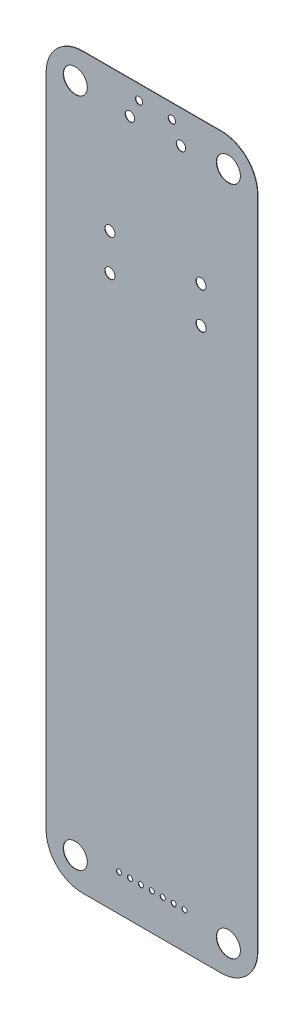
ISO-10303-21;
HEADER;
FILE_DESCRIPTION(('STEP AP214'),'2;1');
FILE_NAME('part.step','',(''),(''),'','','');
FILE_SCHEMA(('AUTOMOTIVE_DESIGN { 1 0 10303 214 1 1 1 1 }'));
ENDSEC;
DATA;
#1=APPLICATION_CONTEXT('core data for automotive mechanical design processes');
#2=APPLICATION_PROTOCOL_DEFINITION('international standard','automotive_design',2000,#1);
#3=PRODUCT_CONTEXT('',#1,'mechanical');
#4=PRODUCT('Part','Part','',(#3));
#5=PRODUCT_RELATED_PRODUCT_CATEGORY('part','',(#4));
#6=PRODUCT_DEFINITION_FORMATION('','',#4);
#7=PRODUCT_DEFINITION_CONTEXT('part definition',#1,'design');
#8=PRODUCT_DEFINITION('design','',#6,#7);
#9=PRODUCT_DEFINITION_SHAPE('','',#8);
#10=(LENGTH_UNIT() NAMED_UNIT(*) SI_UNIT(.MILLI.,.METRE.));
#11=(NAMED_UNIT(*) PLANE_ANGLE_UNIT() SI_UNIT($,.RADIAN.));
#12=(NAMED_UNIT(*) SI_UNIT($,.STERADIAN.) SOLID_ANGLE_UNIT());
#13=UNCERTAINTY_MEASURE_WITH_UNIT(LENGTH_MEASURE(1.E-05),#10,'distance_accuracy_value','');
#14=(GEOMETRIC_REPRESENTATION_CONTEXT(3) GLOBAL_UNCERTAINTY_ASSIGNED_CONTEXT((#13)) GLOBAL_UNIT_ASSIGNED_CONTEXT((#10,
#11,#12)) REPRESENTATION_CONTEXT('',''));
#15=CARTESIAN_POINT('',(0.,0.,0.));
#16=DIRECTION('',(0.,0.,1.));
#17=DIRECTION('',(1.,0.,0.));
#18=AXIS2_PLACEMENT_3D('',#15,#16,#17);
#19=CARTESIAN_POINT('',(14.5,50.,-0.0525));
#20=DIRECTION('',(0.,0.,1.));
#21=DIRECTION('',(1.,0.,0.));
#22=AXIS2_PLACEMENT_3D('',#19,#20,#21);
#23=PLANE('',#22);
#24=CARTESIAN_POINT('',(12.75,98.,-0.052500000000002));
#25=DIRECTION('',(0.,0.,1.));
#26=DIRECTION('',(1.,0.,0.));
#27=AXIS2_PLACEMENT_3D('',#24,#25,#26);
#28=CIRCLE('',#27,0.5);
#29=CARTESIAN_POINT('',(12.25,98.,-0.052500000000002));
#30=VERTEX_POINT('',#29);
#31=EDGE_CURVE('E261',#30,#30,#28,.T.);
#32=ORIENTED_EDGE('',*,*,#31,.T.);
#33=EDGE_LOOP('',(#32));
#34=FACE_BOUND('',#33,.T.);
#35=CARTESIAN_POINT('',(19.,5.,-0.052500000000002));
#36=DIRECTION('',(0.,0.,1.));
#37=DIRECTION('',(1.,0.,0.));
#38=AXIS2_PLACEMENT_3D('',#35,#36,#37);
#39=CIRCLE('',#38,0.35);
#40=CARTESIAN_POINT('',(18.65,5.,-0.052500000000002));
#41=VERTEX_POINT('',#40);
#42=EDGE_CURVE('E324',#41,#41,#39,.T.);
#43=ORIENTED_EDGE('',*,*,#42,.T.);
#44=EDGE_LOOP('',(#43));
#45=FACE_BOUND('',#44,.T.);
#46=CARTESIAN_POINT('',(21.25,75.5,-0.052500000000002));
#47=DIRECTION('',(0.,0.,1.));
#48=DIRECTION('',(1.,0.,0.));
#49=AXIS2_PLACEMENT_3D('',#46,#47,#48);
#50=CIRCLE('',#49,0.7);
#51=CARTESIAN_POINT('',(20.55,75.5,-0.052500000000002));
#52=VERTEX_POINT('',#51);
#53=EDGE_CURVE('E306',#52,#52,#50,.T.);
#54=ORIENTED_EDGE('',*,*,#53,.T.);
#55=EDGE_LOOP('',(#54));
#56=FACE_BOUND('',#55,.T.);
#57=CARTESIAN_POINT('',(16.,5.,-0.052500000000002));
#58=DIRECTION('',(0.,0.,1.));
#59=DIRECTION('',(1.,0.,0.));
#60=AXIS2_PLACEMENT_3D('',#57,#58,#59);
#61=CIRCLE('',#60,0.35);
#62=CARTESIAN_POINT('',(15.65,5.,-0.052500000000002));
#63=VERTEX_POINT('',#62);
#64=EDGE_CURVE('E347',#63,#63,#61,.T.);
#65=ORIENTED_EDGE('',*,*,#64,.T.);
#66=EDGE_LOOP('',(#65));
#67=FACE_BOUND('',#66,.T.);
#68=CARTESIAN_POINT('',(17.25,98.,-0.052500000000002));
#69=DIRECTION('',(0.,0.,1.));
#70=DIRECTION('',(1.,0.,0.));
#71=AXIS2_PLACEMENT_3D('',#68,#69,#70);
#72=CIRCLE('',#71,0.5);
#73=CARTESIAN_POINT('',(16.75,98.,-0.052500000000002));
#74=VERTEX_POINT('',#73);
#75=EDGE_CURVE('E275',#74,#74,#72,.T.);
#76=ORIENTED_EDGE('',*,*,#75,.T.);
#77=EDGE_LOOP('',(#76));
#78=FACE_BOUND('',#77,.T.);
#79=CARTESIAN_POINT('',(17.5,5.,-0.052500000000002));
#80=DIRECTION('',(0.,0.,1.));
#81=DIRECTION('',(1.,0.,0.));
#82=AXIS2_PLACEMENT_3D('',#79,#80,#81);
#83=CIRCLE('',#82,0.35);
#84=CARTESIAN_POINT('',(17.15,5.,-0.052500000000002));
#85=VERTEX_POINT('',#84);
#86=EDGE_CURVE('E333',#85,#85,#83,.T.);
#87=ORIENTED_EDGE('',*,*,#86,.T.);
#88=EDGE_LOOP('',(#87));
#89=FACE_BOUND('',#88,.T.);
#90=CARTESIAN_POINT('',(21.25,80.5,-0.052500000000002));
#91=DIRECTION('',(0.,0.,1.));
#92=DIRECTION('',(1.,0.,0.));
#93=AXIS2_PLACEMENT_3D('',#90,#91,#92);
#94=CIRCLE('',#93,0.7);
#95=CARTESIAN_POINT('',(20.55,80.5,-0.052500000000002));
#96=VERTEX_POINT('',#95);
#97=EDGE_CURVE('E238',#96,#96,#94,.T.);
#98=ORIENTED_EDGE('',*,*,#97,.T.);
#99=EDGE_LOOP('',(#98));
#100=FACE_BOUND('',#99,.T.);
#101=CARTESIAN_POINT('',(11.5,5.,-0.052500000000002));
#102=DIRECTION('',(0.,0.,1.));
#103=DIRECTION('',(1.,0.,0.));
#104=AXIS2_PLACEMENT_3D('',#101,#102,#103);
#105=CIRCLE('',#104,0.35);
#106=CARTESIAN_POINT('',(11.15,5.,-0.052500000000002));
#107=VERTEX_POINT('',#106);
#108=EDGE_CURVE('E343',#107,#107,#105,.T.);
#109=ORIENTED_EDGE('',*,*,#108,.T.);
#110=EDGE_LOOP('',(#109));
#111=FACE_BOUND('',#110,.T.);
#112=CARTESIAN_POINT('',(18.5,95.5,-0.052500000000002));
#113=DIRECTION('',(0.,0.,1.));
#114=DIRECTION('',(1.,0.,0.));
#115=AXIS2_PLACEMENT_3D('',#112,#113,#114);
#116=CIRCLE('',#115,0.65);
#117=CARTESIAN_POINT('',(17.85,95.5,-0.052500000000002));
#118=VERTEX_POINT('',#117);
#119=EDGE_CURVE('E325',#118,#118,#116,.T.);
#120=ORIENTED_EDGE('',*,*,#119,.T.);
#121=EDGE_LOOP('',(#120));
#122=FACE_BOUND('',#121,.T.);
#123=CARTESIAN_POINT('',(10.,5.,-0.052500000000002));
#124=DIRECTION('',(0.,0.,1.));
#125=DIRECTION('',(1.,0.,0.));
#126=AXIS2_PLACEMENT_3D('',#123,#124,#125);
#127=CIRCLE('',#126,0.35);
#128=CARTESIAN_POINT('',(9.65,5.,-0.052500000000002));
#129=VERTEX_POINT('',#128);
#130=EDGE_CURVE('E451',#129,#129,#127,.T.);
#131=ORIENTED_EDGE('',*,*,#130,.T.);
#132=EDGE_LOOP('',(#131));
#133=FACE_BOUND('',#132,.T.);
#134=CARTESIAN_POINT('',(8.75,75.5,-0.052500000000002));
#135=DIRECTION('',(0.,0.,1.));
#136=DIRECTION('',(1.,0.,0.));
#137=AXIS2_PLACEMENT_3D('',#134,#135,#136);
#138=CIRCLE('',#137,0.7);
#139=CARTESIAN_POINT('',(8.05,75.5,-0.052500000000002));
#140=VERTEX_POINT('',#139);
#141=EDGE_CURVE('E370',#140,#140,#138,.T.);
#142=ORIENTED_EDGE('',*,*,#141,.T.);
#143=EDGE_LOOP('',(#142));
#144=FACE_BOUND('',#143,.T.);
#145=CARTESIAN_POINT('',(13.,5.,-0.052500000000002));
#146=DIRECTION('',(0.,0.,1.));
#147=DIRECTION('',(1.,0.,0.));
#148=AXIS2_PLACEMENT_3D('',#145,#146,#147);
#149=CIRCLE('',#148,0.35);
#150=CARTESIAN_POINT('',(12.65,5.,-0.052500000000002));
#151=VERTEX_POINT('',#150);
#152=EDGE_CURVE('E296',#151,#151,#149,.T.);
#153=ORIENTED_EDGE('',*,*,#152,.T.);
#154=EDGE_LOOP('',(#153));
#155=FACE_BOUND('',#154,.T.);
#156=CARTESIAN_POINT('',(11.5,95.5,-0.052500000000002));
#157=DIRECTION('',(0.,0.,1.));
#158=DIRECTION('',(1.,0.,0.));
#159=AXIS2_PLACEMENT_3D('',#156,#157,#158);
#160=CIRCLE('',#159,0.65);
#161=CARTESIAN_POINT('',(10.85,95.5,-0.052500000000002));
#162=VERTEX_POINT('',#161);
#163=EDGE_CURVE('E408',#162,#162,#160,.T.);
#164=ORIENTED_EDGE('',*,*,#163,.T.);
#165=EDGE_LOOP('',(#164));
#166=FACE_BOUND('',#165,.T.);
#167=CARTESIAN_POINT('',(14.5,5.,-0.052500000000002));
#168=DIRECTION('',(0.,0.,1.));
#169=DIRECTION('',(1.,0.,0.));
#170=AXIS2_PLACEMENT_3D('',#167,#168,#169);
#171=CIRCLE('',#170,0.35);
#172=CARTESIAN_POINT('',(14.15,5.,-0.052500000000002));
#173=VERTEX_POINT('',#172);
#174=EDGE_CURVE('E290',#173,#173,#171,.T.);
#175=ORIENTED_EDGE('',*,*,#174,.T.);
#176=EDGE_LOOP('',(#175));
#177=FACE_BOUND('',#176,.T.);
#178=CARTESIAN_POINT('',(8.75,80.5,-0.052500000000002));
#179=DIRECTION('',(0.,0.,1.));
#180=DIRECTION('',(1.,0.,0.));
#181=AXIS2_PLACEMENT_3D('',#178,#179,#180);
#182=CIRCLE('',#181,0.7);
#183=CARTESIAN_POINT('',(8.05,80.5,-0.052500000000002));
#184=VERTEX_POINT('',#183);
#185=EDGE_CURVE('E473',#184,#184,#182,.T.);
#186=ORIENTED_EDGE('',*,*,#185,.T.);
#187=EDGE_LOOP('',(#186));
#188=FACE_BOUND('',#187,.T.);
#189=CARTESIAN_POINT('',(4.,96.,-0.0525));
#190=DIRECTION('',(0.,0.,1.));
#191=DIRECTION('',(1.,0.,0.));
#192=AXIS2_PLACEMENT_3D('',#189,#190,#191);
#193=CIRCLE('',#192,1.651);
#194=CARTESIAN_POINT('',(2.349,96.,-0.0525));
#195=VERTEX_POINT('',#194);
#196=EDGE_CURVE('E255',#195,#195,#193,.T.);
#197=ORIENTED_EDGE('',*,*,#196,.T.);
#198=EDGE_LOOP('',(#197));
#199=FACE_BOUND('',#198,.T.);
#200=CARTESIAN_POINT('',(4.,4.,-0.0525));
#201=DIRECTION('',(0.,0.,1.));
#202=DIRECTION('',(1.,0.,0.));
#203=AXIS2_PLACEMENT_3D('',#200,#201,#202);
#204=CIRCLE('',#203,1.651);
#205=CARTESIAN_POINT('',(2.349,4.,-0.0525));
#206=VERTEX_POINT('',#205);
#207=EDGE_CURVE('E286',#206,#206,#204,.T.);
#208=ORIENTED_EDGE('',*,*,#207,.T.);
#209=EDGE_LOOP('',(#208));
#210=FACE_BOUND('',#209,.T.);
#211=CARTESIAN_POINT('',(25.,96.,-0.0525));
#212=DIRECTION('',(0.,0.,1.));
#213=DIRECTION('',(1.,0.,0.));
#214=AXIS2_PLACEMENT_3D('',#211,#212,#213);
#215=CIRCLE('',#214,1.651);
#216=CARTESIAN_POINT('',(23.349,96.,-0.0525));
#217=VERTEX_POINT('',#216);
#218=EDGE_CURVE('E417',#217,#217,#215,.T.);
#219=ORIENTED_EDGE('',*,*,#218,.T.);
#220=EDGE_LOOP('',(#219));
#221=FACE_BOUND('',#220,.T.);
#222=CARTESIAN_POINT('',(25.,4.,-0.0525));
#223=DIRECTION('',(0.,0.,1.));
#224=DIRECTION('',(1.,0.,0.));
#225=AXIS2_PLACEMENT_3D('',#222,#223,#224);
#226=CIRCLE('',#225,1.651);
#227=CARTESIAN_POINT('',(23.349,4.,-0.0525));
#228=VERTEX_POINT('',#227);
#229=EDGE_CURVE('E338',#228,#228,#226,.T.);
#230=ORIENTED_EDGE('',*,*,#229,.T.);
#231=EDGE_LOOP('',(#230));
#232=FACE_BOUND('',#231,.T.);
#233=DIRECTION('',(0.,1.,0.));
#234=VECTOR('',#233,1.);
#235=CARTESIAN_POINT('',(0.,94.999999767949,-0.0525));
#236=LINE('',#235,#234);
#237=CARTESIAN_POINT('',(0.,4.99999976794896,-0.0525));
#238=VERTEX_POINT('',#237);
#239=CARTESIAN_POINT('',(0.,94.999999767949,-0.0525));
#240=VERTEX_POINT('',#239);
#241=EDGE_CURVE('E11',#238,#240,#236,.T.);
#242=ORIENTED_EDGE('',*,*,#241,.T.);
#243=CARTESIAN_POINT('',(5.,95.,-0.0525));
#244=DIRECTION('',(0.,0.,-1.));
#245=DIRECTION('',(2.67948965237963E-08,1.,0.));
#246=AXIS2_PLACEMENT_3D('',#243,#244,#245);
#247=CIRCLE('',#246,5.);
#248=CARTESIAN_POINT('',(5.00000013397448,100.,-0.0525));
#249=VERTEX_POINT('',#248);
#250=EDGE_CURVE('E318',#240,#249,#247,.T.);
#251=ORIENTED_EDGE('',*,*,#250,.T.);
#252=DIRECTION('',(1.,0.,0.));
#253=VECTOR('',#252,1.);
#254=CARTESIAN_POINT('',(24.0000001339745,100.,-0.0525));
#255=LINE('',#254,#253);
#256=CARTESIAN_POINT('',(24.0000001339745,100.,-0.0525));
#257=VERTEX_POINT('',#256);
#258=EDGE_CURVE('E311',#249,#257,#255,.T.);
#259=ORIENTED_EDGE('',*,*,#258,.T.);
#260=CARTESIAN_POINT('',(24.,95.,-0.0525));
#261=DIRECTION('',(0.,0.,-1.));
#262=DIRECTION('',(1.,0.,0.));
#263=AXIS2_PLACEMENT_3D('',#260,#261,#262);
#264=CIRCLE('',#263,5.);
#265=CARTESIAN_POINT('',(29.,95.,-0.0525));
#266=VERTEX_POINT('',#265);
#267=EDGE_CURVE('E271',#257,#266,#264,.T.);
#268=ORIENTED_EDGE('',*,*,#267,.T.);
#269=DIRECTION('',(0.,-1.,0.));
#270=VECTOR('',#269,1.);
#271=CARTESIAN_POINT('',(29.,4.99999996410207,-0.0525));
#272=LINE('',#271,#270);
#273=CARTESIAN_POINT('',(29.,4.99999996410207,-0.0525));
#274=VERTEX_POINT('',#273);
#275=EDGE_CURVE('E267',#266,#274,#272,.T.);
#276=ORIENTED_EDGE('',*,*,#275,.T.);
#277=CARTESIAN_POINT('',(24.,5.,-0.0525));
#278=DIRECTION('',(0.,0.,-1.));
#279=DIRECTION('',(1.96153102649532E-08,-1.,0.));
#280=AXIS2_PLACEMENT_3D('',#277,#278,#279);
#281=CIRCLE('',#280,5.);
#282=CARTESIAN_POINT('',(24.0000000980766,0.,-0.0525));
#283=VERTEX_POINT('',#282);
#284=EDGE_CURVE('E399',#274,#283,#281,.T.);
#285=ORIENTED_EDGE('',*,*,#284,.T.);
#286=DIRECTION('',(-1.,0.,0.));
#287=VECTOR('',#286,1.);
#288=CARTESIAN_POINT('',(5.00000009807655,0.,-0.0525));
#289=LINE('',#288,#287);
#290=CARTESIAN_POINT('',(5.00000009807655,0.,-0.0525));
#291=VERTEX_POINT('',#290);
#292=EDGE_CURVE('E420',#283,#291,#289,.T.);
#293=ORIENTED_EDGE('',*,*,#292,.T.);
#294=CARTESIAN_POINT('',(5.,5.,-0.0525));
#295=DIRECTION('',(0.,0.,-1.));
#296=DIRECTION('',(-1.,-4.64102066777272E-08,0.));
#297=AXIS2_PLACEMENT_3D('',#294,#295,#296);
#298=CIRCLE('',#297,5.);
#299=EDGE_CURVE('E382',#291,#238,#298,.T.);
#300=ORIENTED_EDGE('',*,*,#299,.T.);
#301=EDGE_LOOP('',(#242,#251,#259,#268,#276,#285,#293,#300));
#302=FACE_BOUND('',#301,.T.);
#303=ADVANCED_FACE('F17',(#34,#45,#56,#67,#78,#89,#100,#111,#122,#133,#144,#155,#166,#177,#188,
#199,#210,#221,#232,#302),#23,.F.);
#304=CARTESIAN_POINT('',(14.5,50.,0.));
#305=DIRECTION('',(0.,0.,1.));
#306=DIRECTION('',(1.,0.,0.));
#307=AXIS2_PLACEMENT_3D('',#304,#305,#306);
#308=PLANE('',#307);
#309=CARTESIAN_POINT('',(12.75,98.,0.));
#310=DIRECTION('',(0.,0.,-1.));
#311=DIRECTION('',(1.,0.,0.));
#312=AXIS2_PLACEMENT_3D('',#309,#310,#311);
#313=CIRCLE('',#312,0.5);
#314=CARTESIAN_POINT('',(12.25,98.,0.));
#315=VERTEX_POINT('',#314);
#316=EDGE_CURVE('E260',#315,#315,#313,.T.);
#317=ORIENTED_EDGE('',*,*,#316,.T.);
#318=EDGE_LOOP('',(#317));
#319=FACE_BOUND('',#318,.T.);
#320=CARTESIAN_POINT('',(19.,5.,0.));
#321=DIRECTION('',(0.,0.,-1.));
#322=DIRECTION('',(1.,0.,0.));
#323=AXIS2_PLACEMENT_3D('',#320,#321,#322);
#324=CIRCLE('',#323,0.35);
#325=CARTESIAN_POINT('',(18.65,5.,0.));
#326=VERTEX_POINT('',#325);
#327=EDGE_CURVE('E323',#326,#326,#324,.T.);
#328=ORIENTED_EDGE('',*,*,#327,.T.);
#329=EDGE_LOOP('',(#328));
#330=FACE_BOUND('',#329,.T.);
#331=CARTESIAN_POINT('',(21.25,75.5,0.));
#332=DIRECTION('',(0.,0.,-1.));
#333=DIRECTION('',(1.,0.,0.));
#334=AXIS2_PLACEMENT_3D('',#331,#332,#333);
#335=CIRCLE('',#334,0.7);
#336=CARTESIAN_POINT('',(20.55,75.5,0.));
#337=VERTEX_POINT('',#336);
#338=EDGE_CURVE('E21',#337,#337,#335,.T.);
#339=ORIENTED_EDGE('',*,*,#338,.T.);
#340=EDGE_LOOP('',(#339));
#341=FACE_BOUND('',#340,.T.);
#342=CARTESIAN_POINT('',(16.,5.,0.));
#343=DIRECTION('',(0.,0.,-1.));
#344=DIRECTION('',(1.,0.,0.));
#345=AXIS2_PLACEMENT_3D('',#342,#343,#344);
#346=CIRCLE('',#345,0.35);
#347=CARTESIAN_POINT('',(15.65,5.,0.));
#348=VERTEX_POINT('',#347);
#349=EDGE_CURVE('E363',#348,#348,#346,.T.);
#350=ORIENTED_EDGE('',*,*,#349,.T.);
#351=EDGE_LOOP('',(#350));
#352=FACE_BOUND('',#351,.T.);
#353=CARTESIAN_POINT('',(17.25,98.,0.));
#354=DIRECTION('',(0.,0.,-1.));
#355=DIRECTION('',(1.,0.,0.));
#356=AXIS2_PLACEMENT_3D('',#353,#354,#355);
#357=CIRCLE('',#356,0.5);
#358=CARTESIAN_POINT('',(16.75,98.,0.));
#359=VERTEX_POINT('',#358);
#360=EDGE_CURVE('E344',#359,#359,#357,.T.);
#361=ORIENTED_EDGE('',*,*,#360,.T.);
#362=EDGE_LOOP('',(#361));
#363=FACE_BOUND('',#362,.T.);
#364=CARTESIAN_POINT('',(17.5,5.,0.));
#365=DIRECTION('',(0.,0.,-1.));
#366=DIRECTION('',(1.,0.,0.));
#367=AXIS2_PLACEMENT_3D('',#364,#365,#366);
#368=CIRCLE('',#367,0.35);
#369=CARTESIAN_POINT('',(17.15,5.,0.));
#370=VERTEX_POINT('',#369);
#371=EDGE_CURVE('E272',#370,#370,#368,.T.);
#372=ORIENTED_EDGE('',*,*,#371,.T.);
#373=EDGE_LOOP('',(#372));
#374=FACE_BOUND('',#373,.T.);
#375=CARTESIAN_POINT('',(21.25,80.5,0.));
#376=DIRECTION('',(0.,0.,-1.));
#377=DIRECTION('',(1.,0.,0.));
#378=AXIS2_PLACEMENT_3D('',#375,#376,#377);
#379=CIRCLE('',#378,0.7);
#380=CARTESIAN_POINT('',(20.55,80.5,0.));
#381=VERTEX_POINT('',#380);
#382=EDGE_CURVE('E239',#381,#381,#379,.T.);
#383=ORIENTED_EDGE('',*,*,#382,.T.);
#384=EDGE_LOOP('',(#383));
#385=FACE_BOUND('',#384,.T.);
#386=CARTESIAN_POINT('',(11.5,5.,0.));
#387=DIRECTION('',(0.,0.,-1.));
#388=DIRECTION('',(1.,0.,0.));
#389=AXIS2_PLACEMENT_3D('',#386,#387,#388);
#390=CIRCLE('',#389,0.35);
#391=CARTESIAN_POINT('',(11.15,5.,0.));
#392=VERTEX_POINT('',#391);
#393=EDGE_CURVE('E245',#392,#392,#390,.T.);
#394=ORIENTED_EDGE('',*,*,#393,.T.);
#395=EDGE_LOOP('',(#394));
#396=FACE_BOUND('',#395,.T.);
#397=CARTESIAN_POINT('',(18.5,95.5,0.));
#398=DIRECTION('',(0.,0.,-1.));
#399=DIRECTION('',(1.,0.,0.));
#400=AXIS2_PLACEMENT_3D('',#397,#398,#399);
#401=CIRCLE('',#400,0.65);
#402=CARTESIAN_POINT('',(17.85,95.5,0.));
#403=VERTEX_POINT('',#402);
#404=EDGE_CURVE('E340',#403,#403,#401,.T.);
#405=ORIENTED_EDGE('',*,*,#404,.T.);
#406=EDGE_LOOP('',(#405));
#407=FACE_BOUND('',#406,.T.);
#408=CARTESIAN_POINT('',(10.,5.,0.));
#409=DIRECTION('',(0.,0.,-1.));
#410=DIRECTION('',(1.,0.,0.));
#411=AXIS2_PLACEMENT_3D('',#408,#409,#410);
#412=CIRCLE('',#411,0.35);
#413=CARTESIAN_POINT('',(9.65,5.,0.));
#414=VERTEX_POINT('',#413);
#415=EDGE_CURVE('E330',#414,#414,#412,.T.);
#416=ORIENTED_EDGE('',*,*,#415,.T.);
#417=EDGE_LOOP('',(#416));
#418=FACE_BOUND('',#417,.T.);
#419=CARTESIAN_POINT('',(8.75,75.5,0.));
#420=DIRECTION('',(0.,0.,-1.));
#421=DIRECTION('',(1.,0.,0.));
#422=AXIS2_PLACEMENT_3D('',#419,#420,#421);
#423=CIRCLE('',#422,0.7);
#424=CARTESIAN_POINT('',(8.05,75.5,0.));
#425=VERTEX_POINT('',#424);
#426=EDGE_CURVE('E455',#425,#425,#423,.T.);
#427=ORIENTED_EDGE('',*,*,#426,.T.);
#428=EDGE_LOOP('',(#427));
#429=FACE_BOUND('',#428,.T.);
#430=CARTESIAN_POINT('',(13.,5.,0.));
#431=DIRECTION('',(0.,0.,-1.));
#432=DIRECTION('',(1.,0.,0.));
#433=AXIS2_PLACEMENT_3D('',#430,#431,#432);
#434=CIRCLE('',#433,0.35);
#435=CARTESIAN_POINT('',(12.65,5.,0.));
#436=VERTEX_POINT('',#435);
#437=EDGE_CURVE('E367',#436,#436,#434,.T.);
#438=ORIENTED_EDGE('',*,*,#437,.T.);
#439=EDGE_LOOP('',(#438));
#440=FACE_BOUND('',#439,.T.);
#441=CARTESIAN_POINT('',(11.5,95.5,0.));
#442=DIRECTION('',(0.,0.,-1.));
#443=DIRECTION('',(1.,0.,0.));
#444=AXIS2_PLACEMENT_3D('',#441,#442,#443);
#445=CIRCLE('',#444,0.65);
#446=CARTESIAN_POINT('',(10.85,95.5,0.));
#447=VERTEX_POINT('',#446);
#448=EDGE_CURVE('E301',#447,#447,#445,.T.);
#449=ORIENTED_EDGE('',*,*,#448,.T.);
#450=EDGE_LOOP('',(#449));
#451=FACE_BOUND('',#450,.T.);
#452=CARTESIAN_POINT('',(14.5,5.,0.));
#453=DIRECTION('',(0.,0.,-1.));
#454=DIRECTION('',(1.,0.,0.));
#455=AXIS2_PLACEMENT_3D('',#452,#453,#454);
#456=CIRCLE('',#455,0.35);
#457=CARTESIAN_POINT('',(14.15,5.,0.));
#458=VERTEX_POINT('',#457);
#459=EDGE_CURVE('E407',#458,#458,#456,.T.);
#460=ORIENTED_EDGE('',*,*,#459,.T.);
#461=EDGE_LOOP('',(#460));
#462=FACE_BOUND('',#461,.T.);
#463=CARTESIAN_POINT('',(8.75,80.5,0.));
#464=DIRECTION('',(0.,0.,-1.));
#465=DIRECTION('',(1.,0.,0.));
#466=AXIS2_PLACEMENT_3D('',#463,#464,#465);
#467=CIRCLE('',#466,0.7);
#468=CARTESIAN_POINT('',(8.05,80.5,0.));
#469=VERTEX_POINT('',#468);
#470=EDGE_CURVE('E288',#469,#469,#467,.T.);
#471=ORIENTED_EDGE('',*,*,#470,.T.);
#472=EDGE_LOOP('',(#471));
#473=FACE_BOUND('',#472,.T.);
#474=CARTESIAN_POINT('',(4.,96.,0.));
#475=DIRECTION('',(0.,0.,-1.));
#476=DIRECTION('',(1.,0.,0.));
#477=AXIS2_PLACEMENT_3D('',#474,#475,#476);
#478=CIRCLE('',#477,1.651);
#479=CARTESIAN_POINT('',(2.349,96.,0.));
#480=VERTEX_POINT('',#479);
#481=EDGE_CURVE('E281',#480,#480,#478,.T.);
#482=ORIENTED_EDGE('',*,*,#481,.T.);
#483=EDGE_LOOP('',(#482));
#484=FACE_BOUND('',#483,.T.);
#485=CARTESIAN_POINT('',(4.,4.,0.));
#486=DIRECTION('',(0.,0.,-1.));
#487=DIRECTION('',(1.,0.,0.));
#488=AXIS2_PLACEMENT_3D('',#485,#486,#487);
#489=CIRCLE('',#488,1.651);
#490=CARTESIAN_POINT('',(2.349,4.,0.));
#491=VERTEX_POINT('',#490);
#492=EDGE_CURVE('E287',#491,#491,#489,.T.);
#493=ORIENTED_EDGE('',*,*,#492,.T.);
#494=EDGE_LOOP('',(#493));
#495=FACE_BOUND('',#494,.T.);
#496=CARTESIAN_POINT('',(25.,96.,0.));
#497=DIRECTION('',(0.,0.,-1.));
#498=DIRECTION('',(1.,0.,0.));
#499=AXIS2_PLACEMENT_3D('',#496,#497,#498);
#500=CIRCLE('',#499,1.651);
#501=CARTESIAN_POINT('',(23.349,96.,0.));
#502=VERTEX_POINT('',#501);
#503=EDGE_CURVE('E385',#502,#502,#500,.T.);
#504=ORIENTED_EDGE('',*,*,#503,.T.);
#505=EDGE_LOOP('',(#504));
#506=FACE_BOUND('',#505,.T.);
#507=CARTESIAN_POINT('',(25.,4.,0.));
#508=DIRECTION('',(0.,0.,-1.));
#509=DIRECTION('',(1.,0.,0.));
#510=AXIS2_PLACEMENT_3D('',#507,#508,#509);
#511=CIRCLE('',#510,1.651);
#512=CARTESIAN_POINT('',(23.349,4.,0.));
#513=VERTEX_POINT('',#512);
#514=EDGE_CURVE('E339',#513,#513,#511,.T.);
#515=ORIENTED_EDGE('',*,*,#514,.T.);
#516=EDGE_LOOP('',(#515));
#517=FACE_BOUND('',#516,.T.);
#518=DIRECTION('',(0.,-1.,0.));
#519=VECTOR('',#518,1.);
#520=CARTESIAN_POINT('',(0.,94.999999767949,0.));
#521=LINE('',#520,#519);
#522=CARTESIAN_POINT('',(0.,94.999999767949,0.));
#523=VERTEX_POINT('',#522);
#524=CARTESIAN_POINT('',(0.,4.99999976794896,0.));
#525=VERTEX_POINT('',#524);
#526=EDGE_CURVE('E28',#523,#525,#521,.T.);
#527=ORIENTED_EDGE('',*,*,#526,.T.);
#528=CARTESIAN_POINT('',(5.,5.,0.));
#529=DIRECTION('',(0.,0.,1.));
#530=DIRECTION('',(-1.,-4.64102066777272E-08,0.));
#531=AXIS2_PLACEMENT_3D('',#528,#529,#530);
#532=CIRCLE('',#531,5.);
#533=CARTESIAN_POINT('',(5.00000009807655,0.,0.));
#534=VERTEX_POINT('',#533);
#535=EDGE_CURVE('E374',#525,#534,#532,.T.);
#536=ORIENTED_EDGE('',*,*,#535,.T.);
#537=DIRECTION('',(1.,0.,0.));
#538=VECTOR('',#537,1.);
#539=CARTESIAN_POINT('',(5.00000009807655,0.,0.));
#540=LINE('',#539,#538);
#541=CARTESIAN_POINT('',(24.0000000980766,0.,0.));
#542=VERTEX_POINT('',#541);
#543=EDGE_CURVE('E394',#534,#542,#540,.T.);
#544=ORIENTED_EDGE('',*,*,#543,.T.);
#545=CARTESIAN_POINT('',(24.,5.,0.));
#546=DIRECTION('',(0.,0.,1.));
#547=DIRECTION('',(1.96153102649532E-08,-1.,0.));
#548=AXIS2_PLACEMENT_3D('',#545,#546,#547);
#549=CIRCLE('',#548,5.);
#550=CARTESIAN_POINT('',(29.,4.99999996410207,0.));
#551=VERTEX_POINT('',#550);
#552=EDGE_CURVE('E395',#542,#551,#549,.T.);
#553=ORIENTED_EDGE('',*,*,#552,.T.);
#554=DIRECTION('',(0.,1.,0.));
#555=VECTOR('',#554,1.);
#556=CARTESIAN_POINT('',(29.,4.99999996410207,0.));
#557=LINE('',#556,#555);
#558=CARTESIAN_POINT('',(29.,95.,0.));
#559=VERTEX_POINT('',#558);
#560=EDGE_CURVE('E351',#551,#559,#557,.T.);
#561=ORIENTED_EDGE('',*,*,#560,.T.);
#562=CARTESIAN_POINT('',(24.,95.,0.));
#563=DIRECTION('',(0.,0.,1.));
#564=DIRECTION('',(1.,0.,0.));
#565=AXIS2_PLACEMENT_3D('',#562,#563,#564);
#566=CIRCLE('',#565,5.);
#567=CARTESIAN_POINT('',(24.0000001339745,100.,0.));
#568=VERTEX_POINT('',#567);
#569=EDGE_CURVE('E266',#559,#568,#566,.T.);
#570=ORIENTED_EDGE('',*,*,#569,.T.);
#571=DIRECTION('',(-1.,0.,0.));
#572=VECTOR('',#571,1.);
#573=CARTESIAN_POINT('',(24.0000001339745,100.,0.));
#574=LINE('',#573,#572);
#575=CARTESIAN_POINT('',(5.00000013397448,100.,0.));
#576=VERTEX_POINT('',#575);
#577=EDGE_CURVE('E307',#568,#576,#574,.T.);
#578=ORIENTED_EDGE('',*,*,#577,.T.);
#579=CARTESIAN_POINT('',(5.,95.,0.));
#580=DIRECTION('',(0.,0.,1.));
#581=DIRECTION('',(2.67948965237963E-08,1.,0.));
#582=AXIS2_PLACEMENT_3D('',#579,#580,#581);
#583=CIRCLE('',#582,5.);
#584=EDGE_CURVE('E356',#576,#523,#583,.T.);
#585=ORIENTED_EDGE('',*,*,#584,.T.);
#586=EDGE_LOOP('',(#527,#536,#544,#553,#561,#570,#578,#585));
#587=FACE_BOUND('',#586,.T.);
#588=ADVANCED_FACE('F534',(#319,#330,#341,#352,#363,#374,#385,#396,#407,#418,#429,#440,#451,
#462,#473,#484,#495,#506,#517,#587),#308,.T.);
#589=CARTESIAN_POINT('',(0.,4.99999976794896,0.));
#590=DIRECTION('',(-1.,0.,0.));
#591=DIRECTION('',(0.,0.,1.));
#592=AXIS2_PLACEMENT_3D('',#589,#590,#591);
#593=PLANE('',#592);
#594=ORIENTED_EDGE('',*,*,#526,.F.);
#595=DIRECTION('',(0.,0.,-1.));
#596=VECTOR('',#595,1.);
#597=CARTESIAN_POINT('',(0.,94.999999767949,0.));
#598=LINE('',#597,#596);
#599=EDGE_CURVE('E315',#523,#240,#598,.T.);
#600=ORIENTED_EDGE('',*,*,#599,.T.);
#601=ORIENTED_EDGE('',*,*,#241,.F.);
#602=DIRECTION('',(0.,0.,-1.));
#603=VECTOR('',#602,1.);
#604=CARTESIAN_POINT('',(0.,4.99999976794896,0.));
#605=LINE('',#604,#603);
#606=EDGE_CURVE('E378',#525,#238,#605,.T.);
#607=ORIENTED_EDGE('',*,*,#606,.F.);
#608=EDGE_LOOP('',(#594,#600,#601,#607));
#609=FACE_BOUND('',#608,.T.);
#610=ADVANCED_FACE('F19',(#609),#593,.T.);
#611=CARTESIAN_POINT('',(5.,95.,0.));
#612=DIRECTION('',(0.,0.,-1.));
#613=DIRECTION('',(2.67948965237963E-08,1.,0.));
#614=AXIS2_PLACEMENT_3D('',#611,#612,#613);
#615=CYLINDRICAL_SURFACE('',#614,5.);
#616=ORIENTED_EDGE('',*,*,#584,.F.);
#617=DIRECTION('',(0.,0.,-1.));
#618=VECTOR('',#617,1.);
#619=CARTESIAN_POINT('',(5.00000013397448,100.,0.));
#620=LINE('',#619,#618);
#621=EDGE_CURVE('E352',#576,#249,#620,.T.);
#622=ORIENTED_EDGE('',*,*,#621,.T.);
#623=ORIENTED_EDGE('',*,*,#250,.F.);
#624=ORIENTED_EDGE('',*,*,#599,.F.);
#625=EDGE_LOOP('',(#616,#622,#623,#624));
#626=FACE_BOUND('',#625,.T.);
#627=ADVANCED_FACE('F653',(#626),#615,.T.);
#628=CARTESIAN_POINT('',(5.00000013397448,100.,0.));
#629=DIRECTION('',(0.,1.,0.));
#630=DIRECTION('',(1.,0.,0.));
#631=AXIS2_PLACEMENT_3D('',#628,#629,#630);
#632=PLANE('',#631);
#633=ORIENTED_EDGE('',*,*,#577,.F.);
#634=DIRECTION('',(0.,0.,-1.));
#635=VECTOR('',#634,1.);
#636=CARTESIAN_POINT('',(24.0000001339745,100.,0.));
#637=LINE('',#636,#635);
#638=EDGE_CURVE('E312',#568,#257,#637,.T.);
#639=ORIENTED_EDGE('',*,*,#638,.T.);
#640=ORIENTED_EDGE('',*,*,#258,.F.);
#641=ORIENTED_EDGE('',*,*,#621,.F.);
#642=EDGE_LOOP('',(#633,#639,#640,#641));
#643=FACE_BOUND('',#642,.T.);
#644=ADVANCED_FACE('F649',(#643),#632,.T.);
#645=CARTESIAN_POINT('',(24.,95.,0.));
#646=DIRECTION('',(0.,0.,-1.));
#647=DIRECTION('',(1.,0.,0.));
#648=AXIS2_PLACEMENT_3D('',#645,#646,#647);
#649=CYLINDRICAL_SURFACE('',#648,5.);
#650=ORIENTED_EDGE('',*,*,#569,.F.);
#651=DIRECTION('',(0.,0.,-1.));
#652=VECTOR('',#651,1.);
#653=CARTESIAN_POINT('',(29.,95.,0.));
#654=LINE('',#653,#652);
#655=EDGE_CURVE('E262',#559,#266,#654,.T.);
#656=ORIENTED_EDGE('',*,*,#655,.T.);
#657=ORIENTED_EDGE('',*,*,#267,.F.);
#658=ORIENTED_EDGE('',*,*,#638,.F.);
#659=EDGE_LOOP('',(#650,#656,#657,#658));
#660=FACE_BOUND('',#659,.T.);
#661=ADVANCED_FACE('F645',(#660),#649,.T.);
#662=CARTESIAN_POINT('',(29.,95.,0.));
#663=DIRECTION('',(1.,0.,0.));
#664=DIRECTION('',(0.,1.,0.));
#665=AXIS2_PLACEMENT_3D('',#662,#663,#664);
#666=PLANE('',#665);
#667=ORIENTED_EDGE('',*,*,#560,.F.);
#668=DIRECTION('',(0.,0.,-1.));
#669=VECTOR('',#668,1.);
#670=CARTESIAN_POINT('',(29.,4.99999996410207,0.));
#671=LINE('',#670,#669);
#672=EDGE_CURVE('E435',#551,#274,#671,.T.);
#673=ORIENTED_EDGE('',*,*,#672,.T.);
#674=ORIENTED_EDGE('',*,*,#275,.F.);
#675=ORIENTED_EDGE('',*,*,#655,.F.);
#676=EDGE_LOOP('',(#667,#673,#674,#675));
#677=FACE_BOUND('',#676,.T.);
#678=ADVANCED_FACE('F648',(#677),#666,.T.);
#679=CARTESIAN_POINT('',(24.,5.,0.));
#680=DIRECTION('',(0.,0.,-1.));
#681=DIRECTION('',(1.96153102649532E-08,-1.,0.));
#682=AXIS2_PLACEMENT_3D('',#679,#680,#681);
#683=CYLINDRICAL_SURFACE('',#682,5.);
#684=ORIENTED_EDGE('',*,*,#552,.F.);
#685=DIRECTION('',(0.,0.,-1.));
#686=VECTOR('',#685,1.);
#687=CARTESIAN_POINT('',(24.0000000980766,0.,0.));
#688=LINE('',#687,#686);
#689=EDGE_CURVE('E400',#542,#283,#688,.T.);
#690=ORIENTED_EDGE('',*,*,#689,.T.);
#691=ORIENTED_EDGE('',*,*,#284,.F.);
#692=ORIENTED_EDGE('',*,*,#672,.F.);
#693=EDGE_LOOP('',(#684,#690,#691,#692));
#694=FACE_BOUND('',#693,.T.);
#695=ADVANCED_FACE('F570',(#694),#683,.T.);
#696=CARTESIAN_POINT('',(24.0000000980766,0.,0.));
#697=DIRECTION('',(0.,-1.,0.));
#698=DIRECTION('',(0.,0.,-1.));
#699=AXIS2_PLACEMENT_3D('',#696,#697,#698);
#700=PLANE('',#699);
#701=ORIENTED_EDGE('',*,*,#543,.F.);
#702=DIRECTION('',(0.,0.,-1.));
#703=VECTOR('',#702,1.);
#704=CARTESIAN_POINT('',(5.00000009807655,0.,0.));
#705=LINE('',#704,#703);
#706=EDGE_CURVE('E390',#534,#291,#705,.T.);
#707=ORIENTED_EDGE('',*,*,#706,.T.);
#708=ORIENTED_EDGE('',*,*,#292,.F.);
#709=ORIENTED_EDGE('',*,*,#689,.F.);
#710=EDGE_LOOP('',(#701,#707,#708,#709));
#711=FACE_BOUND('',#710,.T.);
#712=ADVANCED_FACE('F566',(#711),#700,.T.);
#713=CARTESIAN_POINT('',(5.,5.,0.));
#714=DIRECTION('',(0.,0.,-1.));
#715=DIRECTION('',(-1.,-4.64102066777272E-08,0.));
#716=AXIS2_PLACEMENT_3D('',#713,#714,#715);
#717=CYLINDRICAL_SURFACE('',#716,5.);
#718=ORIENTED_EDGE('',*,*,#535,.F.);
#719=ORIENTED_EDGE('',*,*,#606,.T.);
#720=ORIENTED_EDGE('',*,*,#299,.F.);
#721=ORIENTED_EDGE('',*,*,#706,.F.);
#722=EDGE_LOOP('',(#718,#719,#720,#721));
#723=FACE_BOUND('',#722,.T.);
#724=ADVANCED_FACE('F564',(#723),#717,.T.);
#725=CARTESIAN_POINT('',(12.75,98.,-200.));
#726=DIRECTION('',(0.,0.,1.));
#727=DIRECTION('',(1.,0.,0.));
#728=AXIS2_PLACEMENT_3D('',#725,#726,#727);
#729=CYLINDRICAL_SURFACE('',#728,0.5);
#730=ORIENTED_EDGE('',*,*,#31,.F.);
#731=DIRECTION('',(0.,0.,1.));
#732=VECTOR('',#731,1.);
#733=CARTESIAN_POINT('',(12.25,98.,-200.));
#734=LINE('',#733,#732);
#735=EDGE_CURVE('E257',#30,#315,#734,.T.);
#736=ORIENTED_EDGE('',*,*,#735,.T.);
#737=ORIENTED_EDGE('',*,*,#316,.F.);
#738=ORIENTED_EDGE('',*,*,#735,.F.);
#739=EDGE_LOOP('',(#730,#736,#737,#738));
#740=FACE_BOUND('',#739,.T.);
#741=ADVANCED_FACE('F666',(#740),#729,.F.);
#742=CARTESIAN_POINT('',(19.,5.,-200.));
#743=DIRECTION('',(0.,0.,1.));
#744=DIRECTION('',(1.,0.,0.));
#745=AXIS2_PLACEMENT_3D('',#742,#743,#744);
#746=CYLINDRICAL_SURFACE('',#745,0.35);
#747=ORIENTED_EDGE('',*,*,#42,.F.);
#748=DIRECTION('',(0.,0.,1.));
#749=VECTOR('',#748,1.);
#750=CARTESIAN_POINT('',(18.65,5.,-200.));
#751=LINE('',#750,#749);
#752=EDGE_CURVE('E319',#41,#326,#751,.T.);
#753=ORIENTED_EDGE('',*,*,#752,.T.);
#754=ORIENTED_EDGE('',*,*,#327,.F.);
#755=ORIENTED_EDGE('',*,*,#752,.F.);
#756=EDGE_LOOP('',(#747,#753,#754,#755));
#757=FACE_BOUND('',#756,.T.);
#758=ADVANCED_FACE('F669',(#757),#746,.F.);
#759=CARTESIAN_POINT('',(21.25,75.5,-200.));
#760=DIRECTION('',(0.,0.,1.));
#761=DIRECTION('',(1.,0.,0.));
#762=AXIS2_PLACEMENT_3D('',#759,#760,#761);
#763=CYLINDRICAL_SURFACE('',#762,0.7);
#764=ORIENTED_EDGE('',*,*,#53,.F.);
#765=DIRECTION('',(0.,0.,1.));
#766=VECTOR('',#765,1.);
#767=CARTESIAN_POINT('',(20.55,75.5,-200.));
#768=LINE('',#767,#766);
#769=EDGE_CURVE('E302',#52,#337,#768,.T.);
#770=ORIENTED_EDGE('',*,*,#769,.T.);
#771=ORIENTED_EDGE('',*,*,#338,.F.);
#772=ORIENTED_EDGE('',*,*,#769,.F.);
#773=EDGE_LOOP('',(#764,#770,#771,#772));
#774=FACE_BOUND('',#773,.T.);
#775=ADVANCED_FACE('F634',(#774),#763,.F.);
#776=CARTESIAN_POINT('',(16.,5.,-200.));
#777=DIRECTION('',(0.,0.,1.));
#778=DIRECTION('',(1.,0.,0.));
#779=AXIS2_PLACEMENT_3D('',#776,#777,#778);
#780=CYLINDRICAL_SURFACE('',#779,0.35);
#781=ORIENTED_EDGE('',*,*,#64,.F.);
#782=DIRECTION('',(0.,0.,1.));
#783=VECTOR('',#782,1.);
#784=CARTESIAN_POINT('',(15.65,5.,-200.));
#785=LINE('',#784,#783);
#786=EDGE_CURVE('E366',#63,#348,#785,.T.);
#787=ORIENTED_EDGE('',*,*,#786,.T.);
#788=ORIENTED_EDGE('',*,*,#349,.F.);
#789=ORIENTED_EDGE('',*,*,#786,.F.);
#790=EDGE_LOOP('',(#781,#787,#788,#789));
#791=FACE_BOUND('',#790,.T.);
#792=ADVANCED_FACE('F673',(#791),#780,.F.);
#793=CARTESIAN_POINT('',(17.25,98.,-200.));
#794=DIRECTION('',(0.,0.,1.));
#795=DIRECTION('',(1.,0.,0.));
#796=AXIS2_PLACEMENT_3D('',#793,#794,#795);
#797=CYLINDRICAL_SURFACE('',#796,0.5);
#798=ORIENTED_EDGE('',*,*,#75,.F.);
#799=DIRECTION('',(0.,0.,1.));
#800=VECTOR('',#799,1.);
#801=CARTESIAN_POINT('',(16.75,98.,-200.));
#802=LINE('',#801,#800);
#803=EDGE_CURVE('E348',#74,#359,#802,.T.);
#804=ORIENTED_EDGE('',*,*,#803,.T.);
#805=ORIENTED_EDGE('',*,*,#360,.F.);
#806=ORIENTED_EDGE('',*,*,#803,.F.);
#807=EDGE_LOOP('',(#798,#804,#805,#806));
#808=FACE_BOUND('',#807,.T.);
#809=ADVANCED_FACE('F676',(#808),#797,.F.);
#810=CARTESIAN_POINT('',(17.5,5.,-200.));
#811=DIRECTION('',(0.,0.,1.));
#812=DIRECTION('',(1.,0.,0.));
#813=AXIS2_PLACEMENT_3D('',#810,#811,#812);
#814=CYLINDRICAL_SURFACE('',#813,0.35);
#815=ORIENTED_EDGE('',*,*,#86,.F.);
#816=DIRECTION('',(0.,0.,1.));
#817=VECTOR('',#816,1.);
#818=CARTESIAN_POINT('',(17.15,5.,-200.));
#819=LINE('',#818,#817);
#820=EDGE_CURVE('E276',#85,#370,#819,.T.);
#821=ORIENTED_EDGE('',*,*,#820,.T.);
#822=ORIENTED_EDGE('',*,*,#371,.F.);
#823=ORIENTED_EDGE('',*,*,#820,.F.);
#824=EDGE_LOOP('',(#815,#821,#822,#823));
#825=FACE_BOUND('',#824,.T.);
#826=ADVANCED_FACE('F680',(#825),#814,.F.);
#827=CARTESIAN_POINT('',(21.25,80.5,-200.));
#828=DIRECTION('',(0.,0.,1.));
#829=DIRECTION('',(1.,0.,0.));
#830=AXIS2_PLACEMENT_3D('',#827,#828,#829);
#831=CYLINDRICAL_SURFACE('',#830,0.7);
#832=ORIENTED_EDGE('',*,*,#97,.F.);
#833=DIRECTION('',(0.,0.,1.));
#834=VECTOR('',#833,1.);
#835=CARTESIAN_POINT('',(20.55,80.5,-200.));
#836=LINE('',#835,#834);
#837=EDGE_CURVE('E235',#96,#381,#836,.T.);
#838=ORIENTED_EDGE('',*,*,#837,.T.);
#839=ORIENTED_EDGE('',*,*,#382,.F.);
#840=ORIENTED_EDGE('',*,*,#837,.F.);
#841=EDGE_LOOP('',(#832,#838,#839,#840));
#842=FACE_BOUND('',#841,.T.);
#843=ADVANCED_FACE('F237',(#842),#831,.F.);
#844=CARTESIAN_POINT('',(11.5,5.,-200.));
#845=DIRECTION('',(0.,0.,1.));
#846=DIRECTION('',(1.,0.,0.));
#847=AXIS2_PLACEMENT_3D('',#844,#845,#846);
#848=CYLINDRICAL_SURFACE('',#847,0.35);
#849=ORIENTED_EDGE('',*,*,#108,.F.);
#850=DIRECTION('',(0.,0.,1.));
#851=VECTOR('',#850,1.);
#852=CARTESIAN_POINT('',(11.15,5.,-200.));
#853=LINE('',#852,#851);
#854=EDGE_CURVE('E251',#107,#392,#853,.T.);
#855=ORIENTED_EDGE('',*,*,#854,.T.);
#856=ORIENTED_EDGE('',*,*,#393,.F.);
#857=ORIENTED_EDGE('',*,*,#854,.F.);
#858=EDGE_LOOP('',(#849,#855,#856,#857));
#859=FACE_BOUND('',#858,.T.);
#860=ADVANCED_FACE('F641',(#859),#848,.F.);
#861=CARTESIAN_POINT('',(18.5,95.5,-200.));
#862=DIRECTION('',(0.,0.,1.));
#863=DIRECTION('',(1.,0.,0.));
#864=AXIS2_PLACEMENT_3D('',#861,#862,#863);
#865=CYLINDRICAL_SURFACE('',#864,0.65);
#866=ORIENTED_EDGE('',*,*,#119,.F.);
#867=DIRECTION('',(0.,0.,1.));
#868=VECTOR('',#867,1.);
#869=CARTESIAN_POINT('',(17.85,95.5,-200.));
#870=LINE('',#869,#868);
#871=EDGE_CURVE('E329',#118,#403,#870,.T.);
#872=ORIENTED_EDGE('',*,*,#871,.T.);
#873=ORIENTED_EDGE('',*,*,#404,.F.);
#874=ORIENTED_EDGE('',*,*,#871,.F.);
#875=EDGE_LOOP('',(#866,#872,#873,#874));
#876=FACE_BOUND('',#875,.T.);
#877=ADVANCED_FACE('F595',(#876),#865,.F.);
#878=CARTESIAN_POINT('',(10.,5.,-200.));
#879=DIRECTION('',(0.,0.,1.));
#880=DIRECTION('',(1.,0.,0.));
#881=AXIS2_PLACEMENT_3D('',#878,#879,#880);
#882=CYLINDRICAL_SURFACE('',#881,0.35);
#883=ORIENTED_EDGE('',*,*,#130,.F.);
#884=DIRECTION('',(0.,0.,1.));
#885=VECTOR('',#884,1.);
#886=CARTESIAN_POINT('',(9.65,5.,-200.));
#887=LINE('',#886,#885);
#888=EDGE_CURVE('E454',#129,#414,#887,.T.);
#889=ORIENTED_EDGE('',*,*,#888,.T.);
#890=ORIENTED_EDGE('',*,*,#415,.F.);
#891=ORIENTED_EDGE('',*,*,#888,.F.);
#892=EDGE_LOOP('',(#883,#889,#890,#891));
#893=FACE_BOUND('',#892,.T.);
#894=ADVANCED_FACE('F660',(#893),#882,.F.);
#895=CARTESIAN_POINT('',(8.75,75.5,-200.));
#896=DIRECTION('',(0.,0.,1.));
#897=DIRECTION('',(1.,0.,0.));
#898=AXIS2_PLACEMENT_3D('',#895,#896,#897);
#899=CYLINDRICAL_SURFACE('',#898,0.7);
#900=ORIENTED_EDGE('',*,*,#141,.F.);
#901=DIRECTION('',(0.,0.,1.));
#902=VECTOR('',#901,1.);
#903=CARTESIAN_POINT('',(8.05,75.5,-200.));
#904=LINE('',#903,#902);
#905=EDGE_CURVE('E464',#140,#425,#904,.T.);
#906=ORIENTED_EDGE('',*,*,#905,.T.);
#907=ORIENTED_EDGE('',*,*,#426,.F.);
#908=ORIENTED_EDGE('',*,*,#905,.F.);
#909=EDGE_LOOP('',(#900,#906,#907,#908));
#910=FACE_BOUND('',#909,.T.);
#911=ADVANCED_FACE('F804',(#910),#899,.F.);
#912=CARTESIAN_POINT('',(13.,5.,-200.));
#913=DIRECTION('',(0.,0.,1.));
#914=DIRECTION('',(1.,0.,0.));
#915=AXIS2_PLACEMENT_3D('',#912,#913,#914);
#916=CYLINDRICAL_SURFACE('',#915,0.35);
#917=ORIENTED_EDGE('',*,*,#152,.F.);
#918=DIRECTION('',(0.,0.,1.));
#919=VECTOR('',#918,1.);
#920=CARTESIAN_POINT('',(12.65,5.,-200.));
#921=LINE('',#920,#919);
#922=EDGE_CURVE('E300',#151,#436,#921,.T.);
#923=ORIENTED_EDGE('',*,*,#922,.T.);
#924=ORIENTED_EDGE('',*,*,#437,.F.);
#925=ORIENTED_EDGE('',*,*,#922,.F.);
#926=EDGE_LOOP('',(#917,#923,#924,#925));
#927=FACE_BOUND('',#926,.T.);
#928=ADVANCED_FACE('F604',(#927),#916,.F.);
#929=CARTESIAN_POINT('',(11.5,95.5,-200.));
#930=DIRECTION('',(0.,0.,1.));
#931=DIRECTION('',(1.,0.,0.));
#932=AXIS2_PLACEMENT_3D('',#929,#930,#931);
#933=CYLINDRICAL_SURFACE('',#932,0.65);
#934=ORIENTED_EDGE('',*,*,#163,.F.);
#935=DIRECTION('',(0.,0.,1.));
#936=VECTOR('',#935,1.);
#937=CARTESIAN_POINT('',(10.85,95.5,-200.));
#938=LINE('',#937,#936);
#939=EDGE_CURVE('E411',#162,#447,#938,.T.);
#940=ORIENTED_EDGE('',*,*,#939,.T.);
#941=ORIENTED_EDGE('',*,*,#448,.F.);
#942=ORIENTED_EDGE('',*,*,#939,.F.);
#943=EDGE_LOOP('',(#934,#940,#941,#942));
#944=FACE_BOUND('',#943,.T.);
#945=ADVANCED_FACE('F530',(#944),#933,.F.);
#946=CARTESIAN_POINT('',(14.5,5.,-200.));
#947=DIRECTION('',(0.,0.,1.));
#948=DIRECTION('',(1.,0.,0.));
#949=AXIS2_PLACEMENT_3D('',#946,#947,#948);
#950=CYLINDRICAL_SURFACE('',#949,0.35);
#951=ORIENTED_EDGE('',*,*,#174,.F.);
#952=DIRECTION('',(0.,0.,1.));
#953=VECTOR('',#952,1.);
#954=CARTESIAN_POINT('',(14.15,5.,-200.));
#955=LINE('',#954,#953);
#956=EDGE_CURVE('E403',#173,#458,#955,.T.);
#957=ORIENTED_EDGE('',*,*,#956,.T.);
#958=ORIENTED_EDGE('',*,*,#459,.F.);
#959=ORIENTED_EDGE('',*,*,#956,.F.);
#960=EDGE_LOOP('',(#951,#957,#958,#959));
#961=FACE_BOUND('',#960,.T.);
#962=ADVANCED_FACE('F639',(#961),#950,.F.);
#963=CARTESIAN_POINT('',(8.75,80.5,-200.));
#964=DIRECTION('',(0.,0.,1.));
#965=DIRECTION('',(1.,0.,0.));
#966=AXIS2_PLACEMENT_3D('',#963,#964,#965);
#967=CYLINDRICAL_SURFACE('',#966,0.7);
#968=ORIENTED_EDGE('',*,*,#185,.F.);
#969=DIRECTION('',(0.,0.,1.));
#970=VECTOR('',#969,1.);
#971=CARTESIAN_POINT('',(8.05,80.5,-200.));
#972=LINE('',#971,#970);
#973=EDGE_CURVE('E291',#184,#469,#972,.T.);
#974=ORIENTED_EDGE('',*,*,#973,.T.);
#975=ORIENTED_EDGE('',*,*,#470,.F.);
#976=ORIENTED_EDGE('',*,*,#973,.F.);
#977=EDGE_LOOP('',(#968,#974,#975,#976));
#978=FACE_BOUND('',#977,.T.);
#979=ADVANCED_FACE('F636',(#978),#967,.F.);
#980=CARTESIAN_POINT('',(4.,96.,-0.803));
#981=DIRECTION('',(0.,0.,-1.));
#982=DIRECTION('',(1.,0.,0.));
#983=AXIS2_PLACEMENT_3D('',#980,#981,#982);
#984=CYLINDRICAL_SURFACE('',#983,1.651);
#985=ORIENTED_EDGE('',*,*,#481,.F.);
#986=DIRECTION('',(0.,0.,-1.));
#987=VECTOR('',#986,1.);
#988=CARTESIAN_POINT('',(2.349,96.,-0.803));
#989=LINE('',#988,#987);
#990=EDGE_CURVE('E277',#480,#195,#989,.T.);
#991=ORIENTED_EDGE('',*,*,#990,.T.);
#992=ORIENTED_EDGE('',*,*,#196,.F.);
#993=ORIENTED_EDGE('',*,*,#990,.F.);
#994=EDGE_LOOP('',(#985,#991,#992,#993));
#995=FACE_BOUND('',#994,.T.);
#996=ADVANCED_FACE('F629',(#995),#984,.F.);
#997=CARTESIAN_POINT('',(4.,4.,-0.803));
#998=DIRECTION('',(0.,0.,-1.));
#999=DIRECTION('',(1.,0.,0.));
#1000=AXIS2_PLACEMENT_3D('',#997,#998,#999);
#1001=CYLINDRICAL_SURFACE('',#1000,1.651);
#1002=ORIENTED_EDGE('',*,*,#492,.F.);
#1003=DIRECTION('',(0.,0.,-1.));
#1004=VECTOR('',#1003,1.);
#1005=CARTESIAN_POINT('',(2.349,4.,-0.803));
#1006=LINE('',#1005,#1004);
#1007=EDGE_CURVE('E282',#491,#206,#1006,.T.);
#1008=ORIENTED_EDGE('',*,*,#1007,.T.);
#1009=ORIENTED_EDGE('',*,*,#207,.F.);
#1010=ORIENTED_EDGE('',*,*,#1007,.F.);
#1011=EDGE_LOOP('',(#1002,#1008,#1009,#1010));
#1012=FACE_BOUND('',#1011,.T.);
#1013=ADVANCED_FACE('F621',(#1012),#1001,.F.);
#1014=CARTESIAN_POINT('',(25.,96.,-0.803));
#1015=DIRECTION('',(0.,0.,-1.));
#1016=DIRECTION('',(1.,0.,0.));
#1017=AXIS2_PLACEMENT_3D('',#1014,#1015,#1016);
#1018=CYLINDRICAL_SURFACE('',#1017,1.651);
#1019=ORIENTED_EDGE('',*,*,#503,.F.);
#1020=DIRECTION('',(0.,0.,-1.));
#1021=VECTOR('',#1020,1.);
#1022=CARTESIAN_POINT('',(23.349,96.,-0.803));
#1023=LINE('',#1022,#1021);
#1024=EDGE_CURVE('E389',#502,#217,#1023,.T.);
#1025=ORIENTED_EDGE('',*,*,#1024,.T.);
#1026=ORIENTED_EDGE('',*,*,#218,.F.);
#1027=ORIENTED_EDGE('',*,*,#1024,.F.);
#1028=EDGE_LOOP('',(#1019,#1025,#1026,#1027));
#1029=FACE_BOUND('',#1028,.T.);
#1030=ADVANCED_FACE('F619',(#1029),#1018,.F.);
#1031=CARTESIAN_POINT('',(25.,4.,-0.803));
#1032=DIRECTION('',(0.,0.,-1.));
#1033=DIRECTION('',(1.,0.,0.));
#1034=AXIS2_PLACEMENT_3D('',#1031,#1032,#1033);
#1035=CYLINDRICAL_SURFACE('',#1034,1.651);
#1036=ORIENTED_EDGE('',*,*,#514,.F.);
#1037=DIRECTION('',(0.,0.,-1.));
#1038=VECTOR('',#1037,1.);
#1039=CARTESIAN_POINT('',(23.349,4.,-0.803));
#1040=LINE('',#1039,#1038);
#1041=EDGE_CURVE('E334',#513,#228,#1040,.T.);
#1042=ORIENTED_EDGE('',*,*,#1041,.T.);
#1043=ORIENTED_EDGE('',*,*,#229,.F.);
#1044=ORIENTED_EDGE('',*,*,#1041,.F.);
#1045=EDGE_LOOP('',(#1036,#1042,#1043,#1044));
#1046=FACE_BOUND('',#1045,.T.);
#1047=ADVANCED_FACE('F552',(#1046),#1035,.F.);
#1048=CLOSED_SHELL('',(#303,#588,#610,#627,#644,#661,#678,#695,#712,#724,#741,#758,#775,#792,
#809,#826,#843,#860,#877,#894,#911,#928,#945,#962,#979,#996,#1013,#1030,#1047));
#1049=MANIFOLD_SOLID_BREP('B1',#1048);
#1050=ADVANCED_BREP_SHAPE_REPRESENTATION('',(#18,#1049),#14);
#1051=SHAPE_DEFINITION_REPRESENTATION(#9,#1050);
ENDSEC;
END-ISO-10303-21;
